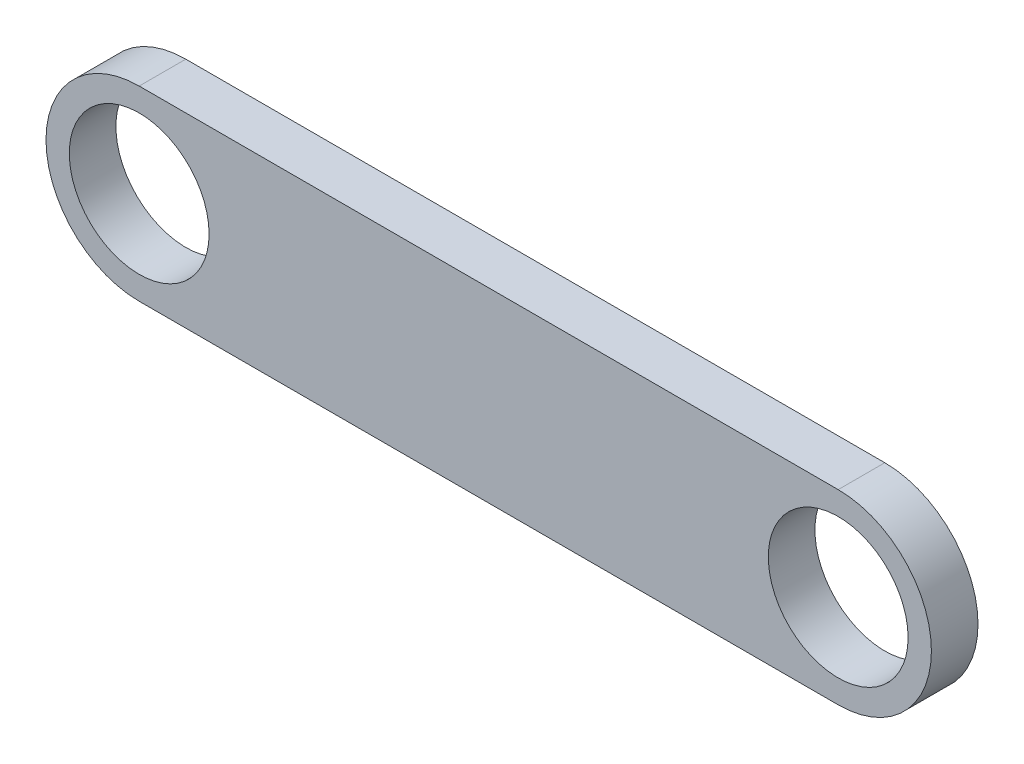
ISO-10303-21;
HEADER;
FILE_DESCRIPTION(('STEP AP214'),'2;1');
FILE_NAME('part.step','',(''),(''),'','','');
FILE_SCHEMA(('AUTOMOTIVE_DESIGN { 1 0 10303 214 1 1 1 1 }'));
ENDSEC;
DATA;
#1=APPLICATION_CONTEXT('core data for automotive mechanical design processes');
#2=APPLICATION_PROTOCOL_DEFINITION('international standard','automotive_design',2000,#1);
#3=PRODUCT_CONTEXT('',#1,'mechanical');
#4=PRODUCT('Part','Part','',(#3));
#5=PRODUCT_RELATED_PRODUCT_CATEGORY('part','',(#4));
#6=PRODUCT_DEFINITION_FORMATION('','',#4);
#7=PRODUCT_DEFINITION_CONTEXT('part definition',#1,'design');
#8=PRODUCT_DEFINITION('design','',#6,#7);
#9=PRODUCT_DEFINITION_SHAPE('','',#8);
#10=(LENGTH_UNIT() NAMED_UNIT(*) SI_UNIT(.MILLI.,.METRE.));
#11=(NAMED_UNIT(*) PLANE_ANGLE_UNIT() SI_UNIT($,.RADIAN.));
#12=(NAMED_UNIT(*) SI_UNIT($,.STERADIAN.) SOLID_ANGLE_UNIT());
#13=UNCERTAINTY_MEASURE_WITH_UNIT(LENGTH_MEASURE(1.E-05),#10,'distance_accuracy_value','');
#14=(GEOMETRIC_REPRESENTATION_CONTEXT(3) GLOBAL_UNCERTAINTY_ASSIGNED_CONTEXT((#13)) GLOBAL_UNIT_ASSIGNED_CONTEXT((#10,
#11,#12)) REPRESENTATION_CONTEXT('',''));
#15=CARTESIAN_POINT('',(0.,0.,0.));
#16=DIRECTION('',(0.,0.,1.));
#17=DIRECTION('',(1.,0.,0.));
#18=AXIS2_PLACEMENT_3D('',#15,#16,#17);
#19=CARTESIAN_POINT('',(0.,0.,10.));
#20=DIRECTION('',(0.,0.,1.));
#21=DIRECTION('',(1.,0.,0.));
#22=AXIS2_PLACEMENT_3D('',#19,#20,#21);
#23=PLANE('',#22);
#24=CARTESIAN_POINT('',(0.,0.,10.));
#25=DIRECTION('',(0.,0.,1.));
#26=DIRECTION('',(1.,0.,0.));
#27=AXIS2_PLACEMENT_3D('',#24,#25,#26);
#28=CIRCLE('',#27,15.);
#29=CARTESIAN_POINT('',(15.,0.,10.));
#30=VERTEX_POINT('',#29);
#31=EDGE_CURVE('E116',#30,#30,#28,.T.);
#32=ORIENTED_EDGE('',*,*,#31,.F.);
#33=EDGE_LOOP('',(#32));
#34=FACE_BOUND('',#33,.T.);
#35=CARTESIAN_POINT('',(0.,0.,10.));
#36=DIRECTION('',(0.,0.,1.));
#37=DIRECTION('',(1.,0.,0.));
#38=AXIS2_PLACEMENT_3D('',#35,#36,#37);
#39=CIRCLE('',#38,20.);
#40=CARTESIAN_POINT('',(0.,20.,10.));
#41=VERTEX_POINT('',#40);
#42=CARTESIAN_POINT('',(0.,-20.,10.));
#43=VERTEX_POINT('',#42);
#44=EDGE_CURVE('E96',#41,#43,#39,.T.);
#45=ORIENTED_EDGE('',*,*,#44,.T.);
#46=DIRECTION('',(1.,0.,0.));
#47=VECTOR('',#46,1.);
#48=CARTESIAN_POINT('',(0.,-20.,10.));
#49=LINE('',#48,#47);
#50=CARTESIAN_POINT('',(150.,-20.,10.));
#51=VERTEX_POINT('',#50);
#52=EDGE_CURVE('E91',#43,#51,#49,.T.);
#53=ORIENTED_EDGE('',*,*,#52,.T.);
#54=CARTESIAN_POINT('',(150.,0.,10.));
#55=DIRECTION('',(0.,0.,1.));
#56=DIRECTION('',(1.,0.,0.));
#57=AXIS2_PLACEMENT_3D('',#54,#55,#56);
#58=CIRCLE('',#57,20.);
#59=CARTESIAN_POINT('',(150.,20.,10.));
#60=VERTEX_POINT('',#59);
#61=EDGE_CURVE('E94',#51,#60,#58,.T.);
#62=ORIENTED_EDGE('',*,*,#61,.T.);
#63=DIRECTION('',(-1.,0.,0.));
#64=VECTOR('',#63,1.);
#65=CARTESIAN_POINT('',(0.,20.,10.));
#66=LINE('',#65,#64);
#67=EDGE_CURVE('E61',#60,#41,#66,.T.);
#68=ORIENTED_EDGE('',*,*,#67,.T.);
#69=EDGE_LOOP('',(#45,#53,#62,#68));
#70=FACE_BOUND('',#69,.T.);
#71=CARTESIAN_POINT('',(150.,0.,10.));
#72=DIRECTION('',(0.,0.,1.));
#73=DIRECTION('',(1.,0.,0.));
#74=AXIS2_PLACEMENT_3D('',#71,#72,#73);
#75=CIRCLE('',#74,15.);
#76=CARTESIAN_POINT('',(165.,0.,10.));
#77=VERTEX_POINT('',#76);
#78=EDGE_CURVE('E138',#77,#77,#75,.T.);
#79=ORIENTED_EDGE('',*,*,#78,.F.);
#80=EDGE_LOOP('',(#79));
#81=FACE_BOUND('',#80,.T.);
#82=ADVANCED_FACE('F43',(#34,#70,#81),#23,.T.);
#83=CARTESIAN_POINT('',(0.,0.,0.));
#84=DIRECTION('',(0.,0.,1.));
#85=DIRECTION('',(1.,0.,0.));
#86=AXIS2_PLACEMENT_3D('',#83,#84,#85);
#87=PLANE('',#86);
#88=CARTESIAN_POINT('',(0.,0.,0.));
#89=DIRECTION('',(0.,0.,1.));
#90=DIRECTION('',(1.,0.,0.));
#91=AXIS2_PLACEMENT_3D('',#88,#89,#90);
#92=CIRCLE('',#91,20.);
#93=CARTESIAN_POINT('',(0.,20.,0.));
#94=VERTEX_POINT('',#93);
#95=CARTESIAN_POINT('',(0.,-20.,0.));
#96=VERTEX_POINT('',#95);
#97=EDGE_CURVE('E112',#94,#96,#92,.T.);
#98=ORIENTED_EDGE('',*,*,#97,.F.);
#99=DIRECTION('',(-1.,0.,0.));
#100=VECTOR('',#99,1.);
#101=CARTESIAN_POINT('',(0.,20.,0.));
#102=LINE('',#101,#100);
#103=CARTESIAN_POINT('',(150.,20.,0.));
#104=VERTEX_POINT('',#103);
#105=EDGE_CURVE('E84',#104,#94,#102,.T.);
#106=ORIENTED_EDGE('',*,*,#105,.F.);
#107=CARTESIAN_POINT('',(150.,0.,0.));
#108=DIRECTION('',(0.,0.,1.));
#109=DIRECTION('',(1.,0.,0.));
#110=AXIS2_PLACEMENT_3D('',#107,#108,#109);
#111=CIRCLE('',#110,20.);
#112=CARTESIAN_POINT('',(150.,-20.,0.));
#113=VERTEX_POINT('',#112);
#114=EDGE_CURVE('E78',#113,#104,#111,.T.);
#115=ORIENTED_EDGE('',*,*,#114,.F.);
#116=DIRECTION('',(1.,0.,0.));
#117=VECTOR('',#116,1.);
#118=CARTESIAN_POINT('',(0.,-20.,0.));
#119=LINE('',#118,#117);
#120=EDGE_CURVE('E101',#96,#113,#119,.T.);
#121=ORIENTED_EDGE('',*,*,#120,.F.);
#122=EDGE_LOOP('',(#98,#106,#115,#121));
#123=FACE_BOUND('',#122,.T.);
#124=CARTESIAN_POINT('',(0.,0.,0.));
#125=DIRECTION('',(0.,0.,1.));
#126=DIRECTION('',(1.,0.,0.));
#127=AXIS2_PLACEMENT_3D('',#124,#125,#126);
#128=CIRCLE('',#127,15.);
#129=CARTESIAN_POINT('',(15.,0.,0.));
#130=VERTEX_POINT('',#129);
#131=EDGE_CURVE('E134',#130,#130,#128,.T.);
#132=ORIENTED_EDGE('',*,*,#131,.T.);
#133=EDGE_LOOP('',(#132));
#134=FACE_BOUND('',#133,.T.);
#135=CARTESIAN_POINT('',(150.,0.,0.));
#136=DIRECTION('',(0.,0.,1.));
#137=DIRECTION('',(1.,0.,0.));
#138=AXIS2_PLACEMENT_3D('',#135,#136,#137);
#139=CIRCLE('',#138,15.);
#140=CARTESIAN_POINT('',(165.,0.,0.));
#141=VERTEX_POINT('',#140);
#142=EDGE_CURVE('E142',#141,#141,#139,.T.);
#143=ORIENTED_EDGE('',*,*,#142,.T.);
#144=EDGE_LOOP('',(#143));
#145=FACE_BOUND('',#144,.T.);
#146=ADVANCED_FACE('F129',(#123,#134,#145),#87,.F.);
#147=CARTESIAN_POINT('',(0.,0.,10.));
#148=DIRECTION('',(0.,0.,-1.));
#149=DIRECTION('',(-1.,0.,0.));
#150=AXIS2_PLACEMENT_3D('',#147,#148,#149);
#151=CYLINDRICAL_SURFACE('',#150,20.);
#152=ORIENTED_EDGE('',*,*,#97,.T.);
#153=DIRECTION('',(0.,0.,-1.));
#154=VECTOR('',#153,1.);
#155=CARTESIAN_POINT('',(0.,-20.,10.));
#156=LINE('',#155,#154);
#157=EDGE_CURVE('E11',#43,#96,#156,.T.);
#158=ORIENTED_EDGE('',*,*,#157,.F.);
#159=ORIENTED_EDGE('',*,*,#44,.F.);
#160=DIRECTION('',(0.,0.,-1.));
#161=VECTOR('',#160,1.);
#162=CARTESIAN_POINT('',(0.,20.,10.));
#163=LINE('',#162,#161);
#164=EDGE_CURVE('E108',#41,#94,#163,.T.);
#165=ORIENTED_EDGE('',*,*,#164,.T.);
#166=EDGE_LOOP('',(#152,#158,#159,#165));
#167=FACE_BOUND('',#166,.T.);
#168=ADVANCED_FACE('F45',(#167),#151,.T.);
#169=CARTESIAN_POINT('',(0.,-20.,10.));
#170=DIRECTION('',(0.,1.,0.));
#171=DIRECTION('',(-1.,0.,0.));
#172=AXIS2_PLACEMENT_3D('',#169,#170,#171);
#173=PLANE('',#172);
#174=ORIENTED_EDGE('',*,*,#120,.T.);
#175=DIRECTION('',(0.,0.,-1.));
#176=VECTOR('',#175,1.);
#177=CARTESIAN_POINT('',(150.,-20.,10.));
#178=LINE('',#177,#176);
#179=EDGE_CURVE('E53',#51,#113,#178,.T.);
#180=ORIENTED_EDGE('',*,*,#179,.F.);
#181=ORIENTED_EDGE('',*,*,#52,.F.);
#182=ORIENTED_EDGE('',*,*,#157,.T.);
#183=EDGE_LOOP('',(#174,#180,#181,#182));
#184=FACE_BOUND('',#183,.T.);
#185=ADVANCED_FACE('F100',(#184),#173,.F.);
#186=CARTESIAN_POINT('',(150.,0.,10.));
#187=DIRECTION('',(0.,0.,-1.));
#188=DIRECTION('',(-1.,0.,0.));
#189=AXIS2_PLACEMENT_3D('',#186,#187,#188);
#190=CYLINDRICAL_SURFACE('',#189,20.);
#191=ORIENTED_EDGE('',*,*,#114,.T.);
#192=DIRECTION('',(0.,0.,-1.));
#193=VECTOR('',#192,1.);
#194=CARTESIAN_POINT('',(150.,20.,10.));
#195=LINE('',#194,#193);
#196=EDGE_CURVE('E103',#60,#104,#195,.T.);
#197=ORIENTED_EDGE('',*,*,#196,.F.);
#198=ORIENTED_EDGE('',*,*,#61,.F.);
#199=ORIENTED_EDGE('',*,*,#179,.T.);
#200=EDGE_LOOP('',(#191,#197,#198,#199));
#201=FACE_BOUND('',#200,.T.);
#202=ADVANCED_FACE('F104',(#201),#190,.T.);
#203=CARTESIAN_POINT('',(0.,20.,10.));
#204=DIRECTION('',(0.,-1.,0.));
#205=DIRECTION('',(1.,0.,0.));
#206=AXIS2_PLACEMENT_3D('',#203,#204,#205);
#207=PLANE('',#206);
#208=ORIENTED_EDGE('',*,*,#105,.T.);
#209=ORIENTED_EDGE('',*,*,#164,.F.);
#210=ORIENTED_EDGE('',*,*,#67,.F.);
#211=ORIENTED_EDGE('',*,*,#196,.T.);
#212=EDGE_LOOP('',(#208,#209,#210,#211));
#213=FACE_BOUND('',#212,.T.);
#214=ADVANCED_FACE('F126',(#213),#207,.F.);
#215=CARTESIAN_POINT('',(0.,0.,10.));
#216=DIRECTION('',(0.,0.,-1.));
#217=DIRECTION('',(-1.,0.,0.));
#218=AXIS2_PLACEMENT_3D('',#215,#216,#217);
#219=CYLINDRICAL_SURFACE('',#218,15.);
#220=ORIENTED_EDGE('',*,*,#31,.T.);
#221=EDGE_LOOP('',(#220));
#222=FACE_BOUND('',#221,.T.);
#223=ORIENTED_EDGE('',*,*,#131,.F.);
#224=EDGE_LOOP('',(#223));
#225=FACE_BOUND('',#224,.T.);
#226=ADVANCED_FACE('F161',(#222,#225),#219,.F.);
#227=CARTESIAN_POINT('',(150.,0.,10.));
#228=DIRECTION('',(0.,0.,-1.));
#229=DIRECTION('',(-1.,0.,0.));
#230=AXIS2_PLACEMENT_3D('',#227,#228,#229);
#231=CYLINDRICAL_SURFACE('',#230,15.);
#232=ORIENTED_EDGE('',*,*,#78,.T.);
#233=EDGE_LOOP('',(#232));
#234=FACE_BOUND('',#233,.T.);
#235=ORIENTED_EDGE('',*,*,#142,.F.);
#236=EDGE_LOOP('',(#235));
#237=FACE_BOUND('',#236,.T.);
#238=ADVANCED_FACE('F150',(#234,#237),#231,.F.);
#239=CLOSED_SHELL('',(#82,#146,#168,#185,#202,#214,#226,#238));
#240=MANIFOLD_SOLID_BREP('B2',#239);
#241=ADVANCED_BREP_SHAPE_REPRESENTATION('',(#18,#240),#14);
#242=SHAPE_DEFINITION_REPRESENTATION(#9,#241);
ENDSEC;
END-ISO-10303-21;
